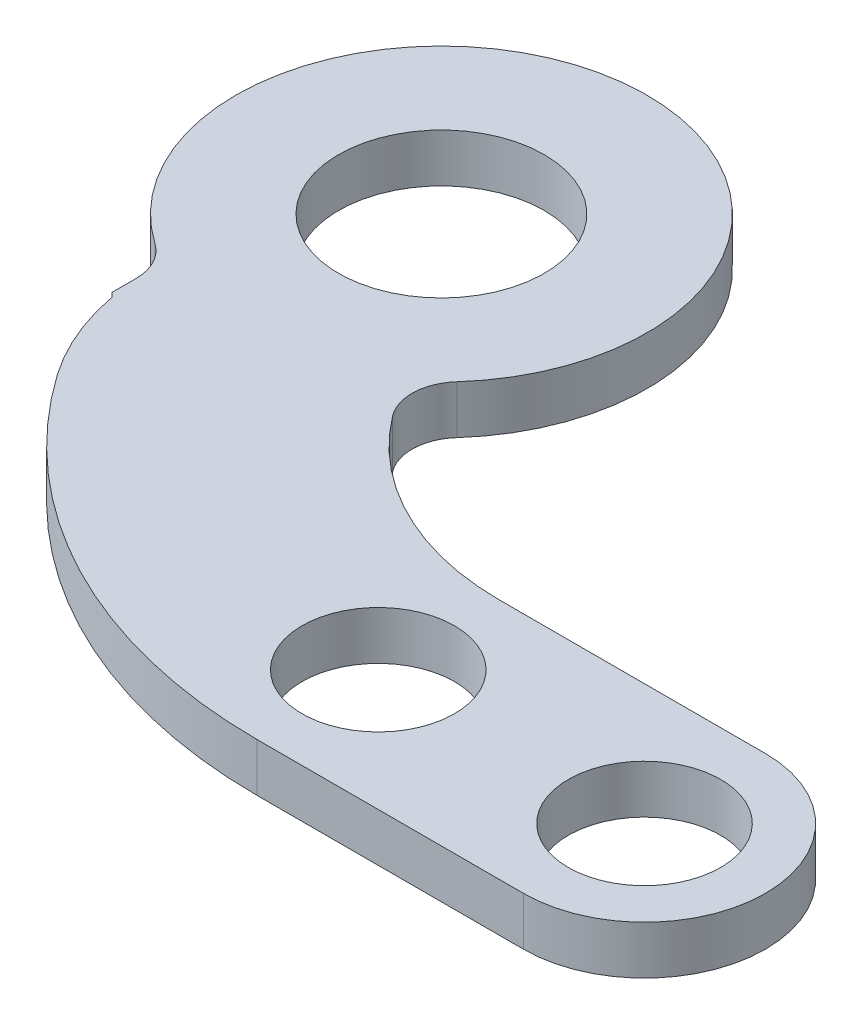
ISO-10303-21;
HEADER;
FILE_DESCRIPTION(('STEP AP214'),'2;1');
FILE_NAME('part.step','',(''),(''),'','','');
FILE_SCHEMA(('AUTOMOTIVE_DESIGN { 1 0 10303 214 1 1 1 1 }'));
ENDSEC;
DATA;
#1=APPLICATION_CONTEXT('core data for automotive mechanical design processes');
#2=APPLICATION_PROTOCOL_DEFINITION('international standard','automotive_design',2000,#1);
#3=PRODUCT_CONTEXT('',#1,'mechanical');
#4=PRODUCT('Part','Part','',(#3));
#5=PRODUCT_RELATED_PRODUCT_CATEGORY('part','',(#4));
#6=PRODUCT_DEFINITION_FORMATION('','',#4);
#7=PRODUCT_DEFINITION_CONTEXT('part definition',#1,'design');
#8=PRODUCT_DEFINITION('design','',#6,#7);
#9=PRODUCT_DEFINITION_SHAPE('','',#8);
#10=(LENGTH_UNIT() NAMED_UNIT(*) SI_UNIT(.MILLI.,.METRE.));
#11=(NAMED_UNIT(*) PLANE_ANGLE_UNIT() SI_UNIT($,.RADIAN.));
#12=(NAMED_UNIT(*) SI_UNIT($,.STERADIAN.) SOLID_ANGLE_UNIT());
#13=UNCERTAINTY_MEASURE_WITH_UNIT(LENGTH_MEASURE(1.E-05),#10,'distance_accuracy_value','');
#14=(GEOMETRIC_REPRESENTATION_CONTEXT(3) GLOBAL_UNCERTAINTY_ASSIGNED_CONTEXT((#13)) GLOBAL_UNIT_ASSIGNED_CONTEXT((#10,
#11,#12)) REPRESENTATION_CONTEXT('',''));
#15=CARTESIAN_POINT('',(0.,0.,0.));
#16=DIRECTION('',(0.,0.,1.));
#17=DIRECTION('',(1.,0.,0.));
#18=AXIS2_PLACEMENT_3D('',#15,#16,#17);
#19=CARTESIAN_POINT('',(8.,1.,0.));
#20=DIRECTION('',(0.,-1.,0.));
#21=DIRECTION('',(0.,0.,-1.));
#22=AXIS2_PLACEMENT_3D('',#19,#20,#21);
#23=PLANE('',#22);
#24=CARTESIAN_POINT('',(19.,1.,-5.89));
#25=DIRECTION('',(0.,-1.,0.));
#26=DIRECTION('',(0.,0.,-1.));
#27=AXIS2_PLACEMENT_3D('',#24,#25,#26);
#28=CIRCLE('',#27,11.);
#29=CARTESIAN_POINT('',(19.,0.999999999999999,5.11));
#30=VERTEX_POINT('',#29);
#31=CARTESIAN_POINT('',(10.20962112305,1.,0.722808722446945));
#32=VERTEX_POINT('',#31);
#33=EDGE_CURVE('E133',#30,#32,#28,.T.);
#34=ORIENTED_EDGE('',*,*,#33,.T.);
#35=CARTESIAN_POINT('',(11.80787182795,1.,-0.479520136179773));
#36=DIRECTION('',(0.,-1.,0.));
#37=DIRECTION('',(0.,0.,-1.));
#38=AXIS2_PLACEMENT_3D('',#35,#36,#37);
#39=CIRCLE('',#38,2.);
#40=CARTESIAN_POINT('',(10.3206581464357,1.,-1.81675439595505));
#41=VERTEX_POINT('',#40);
#42=EDGE_CURVE('E208',#32,#41,#39,.T.);
#43=ORIENTED_EDGE('',*,*,#42,.T.);
#44=CARTESIAN_POINT('',(4.,1.,-7.5));
#45=DIRECTION('',(0.,-1.,0.));
#46=DIRECTION('',(0.,0.,-1.));
#47=AXIS2_PLACEMENT_3D('',#44,#45,#46);
#48=CIRCLE('',#47,8.5);
#49=CARTESIAN_POINT('',(-0.857142857142857,1.,-0.524459643489538));
#50=VERTEX_POINT('',#49);
#51=EDGE_CURVE('E217',#50,#41,#48,.T.);
#52=ORIENTED_EDGE('',*,*,#51,.F.);
#53=CARTESIAN_POINT('',(-2.,1.,1.11684396980704));
#54=DIRECTION('',(0.,-1.,0.));
#55=DIRECTION('',(0.,0.,-1.));
#56=AXIS2_PLACEMENT_3D('',#53,#54,#55);
#57=CIRCLE('',#56,2.);
#58=CARTESIAN_POINT('',(0.,1.,1.11684396980704));
#59=VERTEX_POINT('',#58);
#60=EDGE_CURVE('E11',#50,#59,#57,.T.);
#61=ORIENTED_EDGE('',*,*,#60,.T.);
#62=DIRECTION('',(0.,0.,1.));
#63=VECTOR('',#62,1.);
#64=CARTESIAN_POINT('',(0.,1.,0.));
#65=LINE('',#64,#63);
#66=CARTESIAN_POINT('',(0.,1.,2.11));
#67=VERTEX_POINT('',#66);
#68=EDGE_CURVE('E179',#59,#67,#65,.T.);
#69=ORIENTED_EDGE('',*,*,#68,.T.);
#70=DIRECTION('',(-0.707106781186549,0.,-0.707106781186546));
#71=VECTOR('',#70,1.);
#72=CARTESIAN_POINT('',(0.,1.,2.11));
#73=LINE('',#72,#71);
#74=CARTESIAN_POINT('',(0.172165145084271,1.,2.28216514508427));
#75=VERTEX_POINT('',#74);
#76=EDGE_CURVE('E191',#67,#75,#73,.F.);
#77=ORIENTED_EDGE('',*,*,#76,.T.);
#78=CARTESIAN_POINT('',(10.,1.,0.43455532033676));
#79=DIRECTION('',(0.,1.,0.));
#80=DIRECTION('',(0.,0.,-1.));
#81=AXIS2_PLACEMENT_3D('',#78,#79,#80);
#82=CIRCLE('',#81,10.);
#83=CARTESIAN_POINT('',(1.81818181818182,0.999999999999999,6.18415106609745));
#84=VERTEX_POINT('',#83);
#85=EDGE_CURVE('E162',#75,#84,#82,.T.);
#86=ORIENTED_EDGE('',*,*,#85,.T.);
#87=CARTESIAN_POINT('',(19.,1.,-5.89));
#88=DIRECTION('',(0.,1.,0.));
#89=DIRECTION('',(0.,0.,-1.));
#90=AXIS2_PLACEMENT_3D('',#87,#88,#89);
#91=CIRCLE('',#90,21.);
#92=CARTESIAN_POINT('',(19.,0.999999999999998,15.11));
#93=VERTEX_POINT('',#92);
#94=EDGE_CURVE('E139',#84,#93,#91,.T.);
#95=ORIENTED_EDGE('',*,*,#94,.T.);
#96=DIRECTION('',(1.,0.,0.));
#97=VECTOR('',#96,1.);
#98=CARTESIAN_POINT('',(19.,0.999999999999998,15.11));
#99=LINE('',#98,#97);
#100=CARTESIAN_POINT('',(30.,0.999999999999998,15.11));
#101=VERTEX_POINT('',#100);
#102=EDGE_CURVE('E166',#93,#101,#99,.T.);
#103=ORIENTED_EDGE('',*,*,#102,.T.);
#104=CARTESIAN_POINT('',(30.,0.999999999999999,10.11));
#105=DIRECTION('',(0.,1.,0.));
#106=DIRECTION('',(0.,0.,1.));
#107=AXIS2_PLACEMENT_3D('',#104,#105,#106);
#108=CIRCLE('',#107,5.);
#109=CARTESIAN_POINT('',(30.,0.999999999999999,5.11));
#110=VERTEX_POINT('',#109);
#111=EDGE_CURVE('E169',#101,#110,#108,.T.);
#112=ORIENTED_EDGE('',*,*,#111,.T.);
#113=DIRECTION('',(-1.,0.,0.));
#114=VECTOR('',#113,1.);
#115=CARTESIAN_POINT('',(19.,0.999999999999999,5.11));
#116=LINE('',#115,#114);
#117=EDGE_CURVE('E172',#110,#30,#116,.T.);
#118=ORIENTED_EDGE('',*,*,#117,.T.);
#119=EDGE_LOOP('',(#34,#43,#52,#61,#69,#77,#86,#95,#103,#112,#118));
#120=FACE_BOUND('',#119,.T.);
#121=CARTESIAN_POINT('',(19.,0.999999999999999,10.11));
#122=DIRECTION('',(0.,1.,0.));
#123=DIRECTION('',(0.,0.,-1.));
#124=AXIS2_PLACEMENT_3D('',#121,#122,#123);
#125=CIRCLE('',#124,3.15);
#126=CARTESIAN_POINT('',(19.,0.999999999999999,6.96));
#127=VERTEX_POINT('',#126);
#128=EDGE_CURVE('E291',#127,#127,#125,.T.);
#129=ORIENTED_EDGE('',*,*,#128,.F.);
#130=EDGE_LOOP('',(#129));
#131=FACE_BOUND('',#130,.T.);
#132=CARTESIAN_POINT('',(30.,0.999999999999999,10.11));
#133=DIRECTION('',(0.,1.,0.));
#134=DIRECTION('',(0.,0.,1.));
#135=AXIS2_PLACEMENT_3D('',#132,#133,#134);
#136=CIRCLE('',#135,3.14999999999999);
#137=CARTESIAN_POINT('',(30.,0.999999999999998,13.26));
#138=VERTEX_POINT('',#137);
#139=EDGE_CURVE('E296',#138,#138,#136,.T.);
#140=ORIENTED_EDGE('',*,*,#139,.F.);
#141=EDGE_LOOP('',(#140));
#142=FACE_BOUND('',#141,.T.);
#143=CARTESIAN_POINT('',(4.,1.,-7.5));
#144=DIRECTION('',(0.,-1.,0.));
#145=DIRECTION('',(0.,0.,-1.));
#146=AXIS2_PLACEMENT_3D('',#143,#144,#145);
#147=CIRCLE('',#146,4.25);
#148=CARTESIAN_POINT('',(4.,1.,-11.75));
#149=VERTEX_POINT('',#148);
#150=EDGE_CURVE('E218',#149,#149,#147,.T.);
#151=ORIENTED_EDGE('',*,*,#150,.T.);
#152=EDGE_LOOP('',(#151));
#153=FACE_BOUND('',#152,.T.);
#154=ADVANCED_FACE('F39',(#120,#131,#142,#153),#23,.F.);
#155=CARTESIAN_POINT('',(8.,-1.,0.));
#156=DIRECTION('',(0.,-1.,0.));
#157=DIRECTION('',(0.,0.,-1.));
#158=AXIS2_PLACEMENT_3D('',#155,#156,#157);
#159=PLANE('',#158);
#160=DIRECTION('',(0.,0.,1.));
#161=VECTOR('',#160,1.);
#162=CARTESIAN_POINT('',(0.,-1.,0.));
#163=LINE('',#162,#161);
#164=CARTESIAN_POINT('',(0.,-1.,1.11684396980704));
#165=VERTEX_POINT('',#164);
#166=CARTESIAN_POINT('',(0.,-1.,2.10999999999999));
#167=VERTEX_POINT('',#166);
#168=EDGE_CURVE('E186',#165,#167,#163,.T.);
#169=ORIENTED_EDGE('',*,*,#168,.F.);
#170=CARTESIAN_POINT('',(-2.,-1.,1.11684396980704));
#171=DIRECTION('',(0.,-1.,0.));
#172=DIRECTION('',(0.,0.,-1.));
#173=AXIS2_PLACEMENT_3D('',#170,#171,#172);
#174=CIRCLE('',#173,2.);
#175=CARTESIAN_POINT('',(-0.857142857142857,-1.,-0.524459643489538));
#176=VERTEX_POINT('',#175);
#177=EDGE_CURVE('E47',#165,#176,#174,.F.);
#178=ORIENTED_EDGE('',*,*,#177,.T.);
#179=CARTESIAN_POINT('',(4.,-0.999999999999999,-7.5));
#180=DIRECTION('',(0.,-1.,0.));
#181=DIRECTION('',(0.,0.,-1.));
#182=AXIS2_PLACEMENT_3D('',#179,#180,#181);
#183=CIRCLE('',#182,8.5);
#184=CARTESIAN_POINT('',(10.3206581464357,-1.,-1.81675439595505));
#185=VERTEX_POINT('',#184);
#186=EDGE_CURVE('E211',#176,#185,#183,.T.);
#187=ORIENTED_EDGE('',*,*,#186,.T.);
#188=CARTESIAN_POINT('',(11.80787182795,-1.,-0.479520136179773));
#189=DIRECTION('',(0.,-1.,0.));
#190=DIRECTION('',(0.,0.,-1.));
#191=AXIS2_PLACEMENT_3D('',#188,#189,#190);
#192=CIRCLE('',#191,2.);
#193=CARTESIAN_POINT('',(10.20962112305,-1.,0.722808722446945));
#194=VERTEX_POINT('',#193);
#195=EDGE_CURVE('E206',#185,#194,#192,.F.);
#196=ORIENTED_EDGE('',*,*,#195,.T.);
#197=CARTESIAN_POINT('',(19.,-0.999999999999999,-5.89));
#198=DIRECTION('',(0.,-1.,0.));
#199=DIRECTION('',(0.,0.,-1.));
#200=AXIS2_PLACEMENT_3D('',#197,#198,#199);
#201=CIRCLE('',#200,11.);
#202=CARTESIAN_POINT('',(19.,-1.,5.11));
#203=VERTEX_POINT('',#202);
#204=EDGE_CURVE('E141',#203,#194,#201,.T.);
#205=ORIENTED_EDGE('',*,*,#204,.F.);
#206=DIRECTION('',(-1.,0.,0.));
#207=VECTOR('',#206,1.);
#208=CARTESIAN_POINT('',(19.,-1.,5.11));
#209=LINE('',#208,#207);
#210=CARTESIAN_POINT('',(30.,-1.,5.11));
#211=VERTEX_POINT('',#210);
#212=EDGE_CURVE('E157',#211,#203,#209,.T.);
#213=ORIENTED_EDGE('',*,*,#212,.F.);
#214=CARTESIAN_POINT('',(30.,-1.,10.11));
#215=DIRECTION('',(0.,1.,0.));
#216=DIRECTION('',(0.,0.,1.));
#217=AXIS2_PLACEMENT_3D('',#214,#215,#216);
#218=CIRCLE('',#217,5.);
#219=CARTESIAN_POINT('',(30.,-1.,15.11));
#220=VERTEX_POINT('',#219);
#221=EDGE_CURVE('E151',#220,#211,#218,.T.);
#222=ORIENTED_EDGE('',*,*,#221,.F.);
#223=DIRECTION('',(1.,0.,0.));
#224=VECTOR('',#223,1.);
#225=CARTESIAN_POINT('',(19.,-1.,15.11));
#226=LINE('',#225,#224);
#227=CARTESIAN_POINT('',(19.,-1.,15.11));
#228=VERTEX_POINT('',#227);
#229=EDGE_CURVE('E149',#228,#220,#226,.T.);
#230=ORIENTED_EDGE('',*,*,#229,.F.);
#231=CARTESIAN_POINT('',(19.,-0.999999999999999,-5.89));
#232=DIRECTION('',(0.,1.,0.));
#233=DIRECTION('',(0.,0.,-1.));
#234=AXIS2_PLACEMENT_3D('',#231,#232,#233);
#235=CIRCLE('',#234,21.);
#236=CARTESIAN_POINT('',(1.81818181818182,-1.,6.18415106609745));
#237=VERTEX_POINT('',#236);
#238=EDGE_CURVE('E132',#237,#228,#235,.T.);
#239=ORIENTED_EDGE('',*,*,#238,.F.);
#240=CARTESIAN_POINT('',(10.,-1.,0.43455532033676));
#241=DIRECTION('',(0.,1.,0.));
#242=DIRECTION('',(0.,0.,-1.));
#243=AXIS2_PLACEMENT_3D('',#240,#241,#242);
#244=CIRCLE('',#243,10.);
#245=CARTESIAN_POINT('',(0.172165145084271,-1.,2.28216514508427));
#246=VERTEX_POINT('',#245);
#247=EDGE_CURVE('E121',#246,#237,#244,.T.);
#248=ORIENTED_EDGE('',*,*,#247,.F.);
#249=DIRECTION('',(0.707106781186549,0.,0.707106781186546));
#250=VECTOR('',#249,1.);
#251=CARTESIAN_POINT('',(2.94500000000002,-1.,5.055));
#252=LINE('',#251,#250);
#253=EDGE_CURVE('E194',#246,#167,#252,.F.);
#254=ORIENTED_EDGE('',*,*,#253,.T.);
#255=EDGE_LOOP('',(#169,#178,#187,#196,#205,#213,#222,#230,#239,#248,#254));
#256=FACE_BOUND('',#255,.T.);
#257=CARTESIAN_POINT('',(19.,-1.,10.11));
#258=DIRECTION('',(0.,1.,0.));
#259=DIRECTION('',(0.,0.,-1.));
#260=AXIS2_PLACEMENT_3D('',#257,#258,#259);
#261=CIRCLE('',#260,3.15);
#262=CARTESIAN_POINT('',(19.,-1.,6.96));
#263=VERTEX_POINT('',#262);
#264=EDGE_CURVE('E293',#263,#263,#261,.T.);
#265=ORIENTED_EDGE('',*,*,#264,.T.);
#266=EDGE_LOOP('',(#265));
#267=FACE_BOUND('',#266,.T.);
#268=CARTESIAN_POINT('',(30.,-1.,10.11));
#269=DIRECTION('',(0.,1.,0.));
#270=DIRECTION('',(0.,0.,1.));
#271=AXIS2_PLACEMENT_3D('',#268,#269,#270);
#272=CIRCLE('',#271,3.14999999999999);
#273=CARTESIAN_POINT('',(30.,-1.,13.26));
#274=VERTEX_POINT('',#273);
#275=EDGE_CURVE('E164',#274,#274,#272,.T.);
#276=ORIENTED_EDGE('',*,*,#275,.T.);
#277=EDGE_LOOP('',(#276));
#278=FACE_BOUND('',#277,.T.);
#279=CARTESIAN_POINT('',(4.,-0.999999999999999,-7.5));
#280=DIRECTION('',(0.,-1.,0.));
#281=DIRECTION('',(0.,0.,-1.));
#282=AXIS2_PLACEMENT_3D('',#279,#280,#281);
#283=CIRCLE('',#282,4.25);
#284=CARTESIAN_POINT('',(4.,-0.999999999999999,-11.75));
#285=VERTEX_POINT('',#284);
#286=EDGE_CURVE('E283',#285,#285,#283,.T.);
#287=ORIENTED_EDGE('',*,*,#286,.F.);
#288=EDGE_LOOP('',(#287));
#289=FACE_BOUND('',#288,.T.);
#290=ADVANCED_FACE('F145',(#256,#267,#278,#289),#159,.T.);
#291=CARTESIAN_POINT('',(0.,0.,0.));
#292=DIRECTION('',(-1.,0.,0.));
#293=DIRECTION('',(0.,0.,1.));
#294=AXIS2_PLACEMENT_3D('',#291,#292,#293);
#295=PLANE('',#294);
#296=ORIENTED_EDGE('',*,*,#68,.F.);
#297=DIRECTION('',(0.,1.,0.));
#298=VECTOR('',#297,1.);
#299=CARTESIAN_POINT('',(0.,-1.,1.11684396980704));
#300=LINE('',#299,#298);
#301=EDGE_CURVE('E204',#59,#165,#300,.F.);
#302=ORIENTED_EDGE('',*,*,#301,.T.);
#303=ORIENTED_EDGE('',*,*,#168,.T.);
#304=DIRECTION('',(0.,1.,0.));
#305=VECTOR('',#304,1.);
#306=CARTESIAN_POINT('',(0.,0.,2.11));
#307=LINE('',#306,#305);
#308=EDGE_CURVE('E188',#167,#67,#307,.T.);
#309=ORIENTED_EDGE('',*,*,#308,.T.);
#310=EDGE_LOOP('',(#296,#302,#303,#309));
#311=FACE_BOUND('',#310,.T.);
#312=ADVANCED_FACE('F221',(#311),#295,.T.);
#313=CARTESIAN_POINT('',(0.,0.,2.11));
#314=DIRECTION('',(0.707106781186546,0.,-0.707106781186549));
#315=DIRECTION('',(0.,1.,0.));
#316=AXIS2_PLACEMENT_3D('',#313,#314,#315);
#317=PLANE('',#316);
#318=DIRECTION('',(0.,1.,0.));
#319=VECTOR('',#318,1.);
#320=CARTESIAN_POINT('',(0.172165145084272,-1.,2.28216514508427));
#321=LINE('',#320,#319);
#322=EDGE_CURVE('E127',#75,#246,#321,.F.);
#323=ORIENTED_EDGE('',*,*,#322,.F.);
#324=ORIENTED_EDGE('',*,*,#76,.F.);
#325=ORIENTED_EDGE('',*,*,#308,.F.);
#326=ORIENTED_EDGE('',*,*,#253,.F.);
#327=EDGE_LOOP('',(#323,#324,#325,#326));
#328=FACE_BOUND('',#327,.T.);
#329=ADVANCED_FACE('F226',(#328),#317,.F.);
#330=CARTESIAN_POINT('',(19.,-0.999999999999999,-5.89));
#331=DIRECTION('',(0.,1.,0.));
#332=DIRECTION('',(0.,0.,1.));
#333=AXIS2_PLACEMENT_3D('',#330,#331,#332);
#334=CYLINDRICAL_SURFACE('',#333,11.);
#335=ORIENTED_EDGE('',*,*,#204,.T.);
#336=DIRECTION('',(0.,1.,0.));
#337=VECTOR('',#336,1.);
#338=CARTESIAN_POINT('',(10.20962112305,-1.,0.722808722446946));
#339=LINE('',#338,#337);
#340=EDGE_CURVE('E202',#194,#32,#339,.T.);
#341=ORIENTED_EDGE('',*,*,#340,.T.);
#342=ORIENTED_EDGE('',*,*,#33,.F.);
#343=DIRECTION('',(0.,1.,0.));
#344=VECTOR('',#343,1.);
#345=CARTESIAN_POINT('',(19.,-1.,5.11));
#346=LINE('',#345,#344);
#347=EDGE_CURVE('E177',#203,#30,#346,.T.);
#348=ORIENTED_EDGE('',*,*,#347,.F.);
#349=EDGE_LOOP('',(#335,#341,#342,#348));
#350=FACE_BOUND('',#349,.T.);
#351=ADVANCED_FACE('F228',(#350),#334,.F.);
#352=CARTESIAN_POINT('',(19.,-1.,5.11));
#353=DIRECTION('',(0.,0.,-1.));
#354=DIRECTION('',(0.,1.,0.));
#355=AXIS2_PLACEMENT_3D('',#352,#353,#354);
#356=PLANE('',#355);
#357=ORIENTED_EDGE('',*,*,#117,.F.);
#358=DIRECTION('',(0.,1.,0.));
#359=VECTOR('',#358,1.);
#360=CARTESIAN_POINT('',(30.,-1.,5.11));
#361=LINE('',#360,#359);
#362=EDGE_CURVE('E180',#211,#110,#361,.T.);
#363=ORIENTED_EDGE('',*,*,#362,.F.);
#364=ORIENTED_EDGE('',*,*,#212,.T.);
#365=ORIENTED_EDGE('',*,*,#347,.T.);
#366=EDGE_LOOP('',(#357,#363,#364,#365));
#367=FACE_BOUND('',#366,.T.);
#368=ADVANCED_FACE('F234',(#367),#356,.T.);
#369=CARTESIAN_POINT('',(30.,-1.,10.11));
#370=DIRECTION('',(0.,1.,0.));
#371=DIRECTION('',(0.,0.,1.));
#372=AXIS2_PLACEMENT_3D('',#369,#370,#371);
#373=CYLINDRICAL_SURFACE('',#372,5.);
#374=ORIENTED_EDGE('',*,*,#111,.F.);
#375=DIRECTION('',(0.,1.,0.));
#376=VECTOR('',#375,1.);
#377=CARTESIAN_POINT('',(30.,-1.,15.11));
#378=LINE('',#377,#376);
#379=EDGE_CURVE('E182',#220,#101,#378,.T.);
#380=ORIENTED_EDGE('',*,*,#379,.F.);
#381=ORIENTED_EDGE('',*,*,#221,.T.);
#382=ORIENTED_EDGE('',*,*,#362,.T.);
#383=EDGE_LOOP('',(#374,#380,#381,#382));
#384=FACE_BOUND('',#383,.T.);
#385=ADVANCED_FACE('F253',(#384),#373,.T.);
#386=CARTESIAN_POINT('',(19.,-1.,15.11));
#387=DIRECTION('',(0.,0.,1.));
#388=DIRECTION('',(0.,-1.,0.));
#389=AXIS2_PLACEMENT_3D('',#386,#387,#388);
#390=PLANE('',#389);
#391=ORIENTED_EDGE('',*,*,#102,.F.);
#392=DIRECTION('',(0.,1.,0.));
#393=VECTOR('',#392,1.);
#394=CARTESIAN_POINT('',(19.,-1.,15.11));
#395=LINE('',#394,#393);
#396=EDGE_CURVE('E140',#228,#93,#395,.T.);
#397=ORIENTED_EDGE('',*,*,#396,.F.);
#398=ORIENTED_EDGE('',*,*,#229,.T.);
#399=ORIENTED_EDGE('',*,*,#379,.T.);
#400=EDGE_LOOP('',(#391,#397,#398,#399));
#401=FACE_BOUND('',#400,.T.);
#402=ADVANCED_FACE('F250',(#401),#390,.T.);
#403=CARTESIAN_POINT('',(19.,-0.999999999999999,-5.89));
#404=DIRECTION('',(0.,1.,0.));
#405=DIRECTION('',(0.,0.,1.));
#406=AXIS2_PLACEMENT_3D('',#403,#404,#405);
#407=CYLINDRICAL_SURFACE('',#406,21.);
#408=ORIENTED_EDGE('',*,*,#94,.F.);
#409=DIRECTION('',(0.,1.,0.));
#410=VECTOR('',#409,1.);
#411=CARTESIAN_POINT('',(1.81818181818182,-1.,6.18415106609745));
#412=LINE('',#411,#410);
#413=EDGE_CURVE('E124',#237,#84,#412,.T.);
#414=ORIENTED_EDGE('',*,*,#413,.F.);
#415=ORIENTED_EDGE('',*,*,#238,.T.);
#416=ORIENTED_EDGE('',*,*,#396,.T.);
#417=EDGE_LOOP('',(#408,#414,#415,#416));
#418=FACE_BOUND('',#417,.T.);
#419=ADVANCED_FACE('F137',(#418),#407,.T.);
#420=CARTESIAN_POINT('',(10.,-1.,0.43455532033676));
#421=DIRECTION('',(0.,1.,0.));
#422=DIRECTION('',(0.,0.,1.));
#423=AXIS2_PLACEMENT_3D('',#420,#421,#422);
#424=CYLINDRICAL_SURFACE('',#423,10.);
#425=ORIENTED_EDGE('',*,*,#85,.F.);
#426=ORIENTED_EDGE('',*,*,#322,.T.);
#427=ORIENTED_EDGE('',*,*,#247,.T.);
#428=ORIENTED_EDGE('',*,*,#413,.T.);
#429=EDGE_LOOP('',(#425,#426,#427,#428));
#430=FACE_BOUND('',#429,.T.);
#431=ADVANCED_FACE('F123',(#430),#424,.T.);
#432=CARTESIAN_POINT('',(30.,-1.,10.11));
#433=DIRECTION('',(0.,1.,0.));
#434=DIRECTION('',(0.,0.,1.));
#435=AXIS2_PLACEMENT_3D('',#432,#433,#434);
#436=CYLINDRICAL_SURFACE('',#435,3.14999999999999);
#437=ORIENTED_EDGE('',*,*,#275,.F.);
#438=EDGE_LOOP('',(#437));
#439=FACE_BOUND('',#438,.T.);
#440=ORIENTED_EDGE('',*,*,#139,.T.);
#441=EDGE_LOOP('',(#440));
#442=FACE_BOUND('',#441,.T.);
#443=ADVANCED_FACE('F247',(#439,#442),#436,.F.);
#444=CARTESIAN_POINT('',(19.,-1.,10.11));
#445=DIRECTION('',(0.,1.,0.));
#446=DIRECTION('',(0.,0.,1.));
#447=AXIS2_PLACEMENT_3D('',#444,#445,#446);
#448=CYLINDRICAL_SURFACE('',#447,3.15);
#449=ORIENTED_EDGE('',*,*,#264,.F.);
#450=EDGE_LOOP('',(#449));
#451=FACE_BOUND('',#450,.T.);
#452=ORIENTED_EDGE('',*,*,#128,.T.);
#453=EDGE_LOOP('',(#452));
#454=FACE_BOUND('',#453,.T.);
#455=ADVANCED_FACE('F263',(#451,#454),#448,.F.);
#456=CARTESIAN_POINT('',(4.,1.,-7.5));
#457=DIRECTION('',(0.,-1.,0.));
#458=DIRECTION('',(0.,0.,-1.));
#459=AXIS2_PLACEMENT_3D('',#456,#457,#458);
#460=CYLINDRICAL_SURFACE('',#459,8.5);
#461=ORIENTED_EDGE('',*,*,#51,.T.);
#462=DIRECTION('',(0.,-1.,0.));
#463=VECTOR('',#462,1.);
#464=CARTESIAN_POINT('',(10.3206581464357,1.,-1.81675439595505));
#465=LINE('',#464,#463);
#466=EDGE_CURVE('E199',#41,#185,#465,.T.);
#467=ORIENTED_EDGE('',*,*,#466,.T.);
#468=ORIENTED_EDGE('',*,*,#186,.F.);
#469=DIRECTION('',(0.,-1.,0.));
#470=VECTOR('',#469,1.);
#471=CARTESIAN_POINT('',(-0.857142857142857,1.,-0.524459643489538));
#472=LINE('',#471,#470);
#473=EDGE_CURVE('E197',#176,#50,#472,.F.);
#474=ORIENTED_EDGE('',*,*,#473,.T.);
#475=EDGE_LOOP('',(#461,#467,#468,#474));
#476=FACE_BOUND('',#475,.T.);
#477=ADVANCED_FACE('F214',(#476),#460,.T.);
#478=CARTESIAN_POINT('',(4.,1.,-7.5));
#479=DIRECTION('',(0.,-1.,0.));
#480=DIRECTION('',(0.,0.,-1.));
#481=AXIS2_PLACEMENT_3D('',#478,#479,#480);
#482=CYLINDRICAL_SURFACE('',#481,4.25);
#483=ORIENTED_EDGE('',*,*,#150,.F.);
#484=EDGE_LOOP('',(#483));
#485=FACE_BOUND('',#484,.T.);
#486=ORIENTED_EDGE('',*,*,#286,.T.);
#487=EDGE_LOOP('',(#486));
#488=FACE_BOUND('',#487,.T.);
#489=ADVANCED_FACE('F270',(#485,#488),#482,.F.);
#490=CARTESIAN_POINT('',(11.80787182795,-1.,-0.479520136179773));
#491=DIRECTION('',(0.,-1.,0.));
#492=DIRECTION('',(0.,0.,-1.));
#493=AXIS2_PLACEMENT_3D('',#490,#491,#492);
#494=CYLINDRICAL_SURFACE('',#493,2.);
#495=ORIENTED_EDGE('',*,*,#42,.F.);
#496=ORIENTED_EDGE('',*,*,#340,.F.);
#497=ORIENTED_EDGE('',*,*,#195,.F.);
#498=ORIENTED_EDGE('',*,*,#466,.F.);
#499=EDGE_LOOP('',(#495,#496,#497,#498));
#500=FACE_BOUND('',#499,.T.);
#501=ADVANCED_FACE('F272',(#500),#494,.F.);
#502=CARTESIAN_POINT('',(-2.,1.,1.11684396980704));
#503=DIRECTION('',(0.,-1.,0.));
#504=DIRECTION('',(0.,0.,-1.));
#505=AXIS2_PLACEMENT_3D('',#502,#503,#504);
#506=CYLINDRICAL_SURFACE('',#505,2.);
#507=ORIENTED_EDGE('',*,*,#60,.F.);
#508=ORIENTED_EDGE('',*,*,#473,.F.);
#509=ORIENTED_EDGE('',*,*,#177,.F.);
#510=ORIENTED_EDGE('',*,*,#301,.F.);
#511=EDGE_LOOP('',(#507,#508,#509,#510));
#512=FACE_BOUND('',#511,.T.);
#513=ADVANCED_FACE('F41',(#512),#506,.F.);
#514=CLOSED_SHELL('',(#154,#290,#312,#329,#351,#368,#385,#402,#419,#431,#443,#455,#477,#489,
#501,#513));
#515=MANIFOLD_SOLID_BREP('B2',#514);
#516=ADVANCED_BREP_SHAPE_REPRESENTATION('',(#18,#515),#14);
#517=SHAPE_DEFINITION_REPRESENTATION(#9,#516);
ENDSEC;
END-ISO-10303-21;
